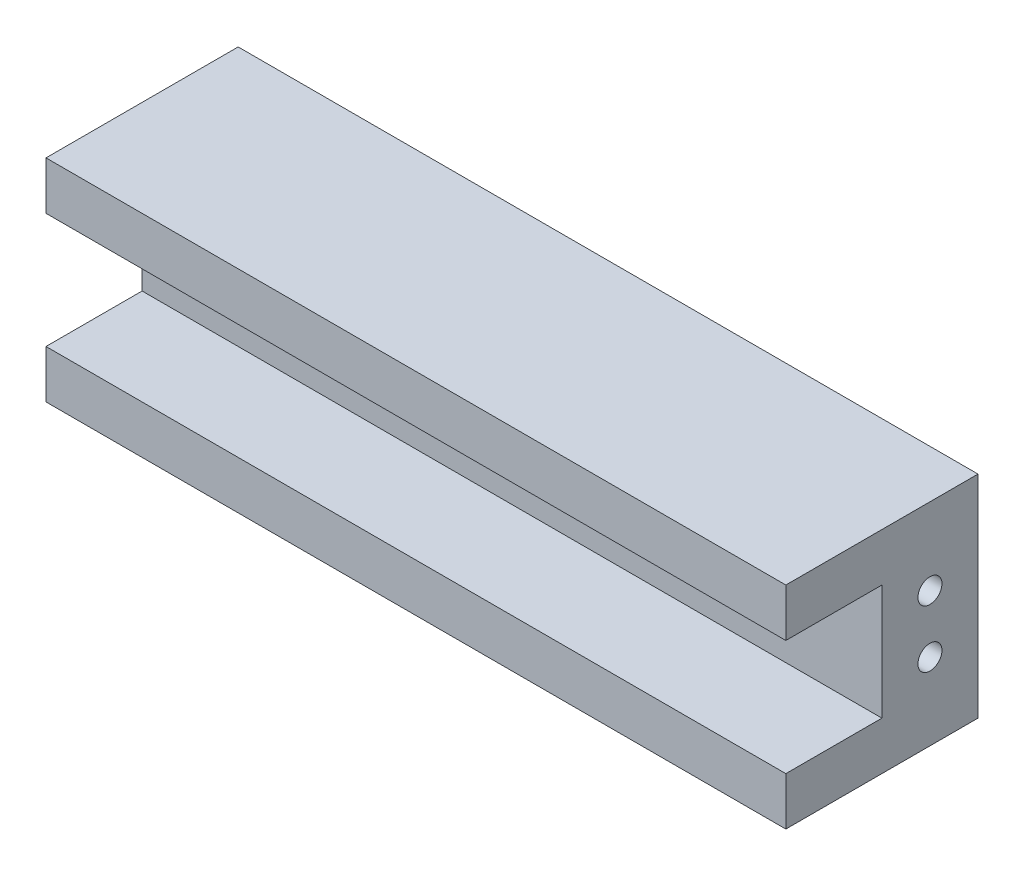
ISO-10303-21;
HEADER;
FILE_DESCRIPTION(('STEP AP214'),'2;1');
FILE_NAME('part.step','',(''),(''),'','','');
FILE_SCHEMA(('AUTOMOTIVE_DESIGN { 1 0 10303 214 1 1 1 1 }'));
ENDSEC;
DATA;
#1=APPLICATION_CONTEXT('core data for automotive mechanical design processes');
#2=APPLICATION_PROTOCOL_DEFINITION('international standard','automotive_design',2000,#1);
#3=PRODUCT_CONTEXT('',#1,'mechanical');
#4=PRODUCT('Part','Part','',(#3));
#5=PRODUCT_RELATED_PRODUCT_CATEGORY('part','',(#4));
#6=PRODUCT_DEFINITION_FORMATION('','',#4);
#7=PRODUCT_DEFINITION_CONTEXT('part definition',#1,'design');
#8=PRODUCT_DEFINITION('design','',#6,#7);
#9=PRODUCT_DEFINITION_SHAPE('','',#8);
#10=(LENGTH_UNIT() NAMED_UNIT(*) SI_UNIT(.MILLI.,.METRE.));
#11=(NAMED_UNIT(*) PLANE_ANGLE_UNIT() SI_UNIT($,.RADIAN.));
#12=(NAMED_UNIT(*) SI_UNIT($,.STERADIAN.) SOLID_ANGLE_UNIT());
#13=UNCERTAINTY_MEASURE_WITH_UNIT(LENGTH_MEASURE(1.E-05),#10,'distance_accuracy_value','');
#14=(GEOMETRIC_REPRESENTATION_CONTEXT(3) GLOBAL_UNCERTAINTY_ASSIGNED_CONTEXT((#13)) GLOBAL_UNIT_ASSIGNED_CONTEXT((#10,
#11,#12)) REPRESENTATION_CONTEXT('',''));
#15=CARTESIAN_POINT('',(0.,0.,0.));
#16=DIRECTION('',(0.,0.,1.));
#17=DIRECTION('',(1.,0.,0.));
#18=AXIS2_PLACEMENT_3D('',#15,#16,#17);
#19=CARTESIAN_POINT('',(0.,0.,10.));
#20=DIRECTION('',(1.,0.,0.));
#21=DIRECTION('',(0.,0.,-1.));
#22=AXIS2_PLACEMENT_3D('',#19,#20,#21);
#23=PLANE('',#22);
#24=CARTESIAN_POINT('',(0.,3.,5.));
#25=DIRECTION('',(1.,0.,0.));
#26=DIRECTION('',(0.,0.,-1.));
#27=AXIS2_PLACEMENT_3D('',#24,#25,#26);
#28=CIRCLE('',#27,1.25);
#29=CARTESIAN_POINT('',(0.,3.,3.75));
#30=VERTEX_POINT('',#29);
#31=EDGE_CURVE('E158',#30,#30,#28,.T.);
#32=ORIENTED_EDGE('',*,*,#31,.T.);
#33=EDGE_LOOP('',(#32));
#34=FACE_BOUND('',#33,.T.);
#35=CARTESIAN_POINT('',(0.,9.,5.));
#36=DIRECTION('',(1.,0.,0.));
#37=DIRECTION('',(0.,0.,-1.));
#38=AXIS2_PLACEMENT_3D('',#35,#36,#37);
#39=CIRCLE('',#38,1.25);
#40=CARTESIAN_POINT('',(0.,9.,3.75));
#41=VERTEX_POINT('',#40);
#42=EDGE_CURVE('E153',#41,#41,#39,.T.);
#43=ORIENTED_EDGE('',*,*,#42,.T.);
#44=EDGE_LOOP('',(#43));
#45=FACE_BOUND('',#44,.T.);
#46=DIRECTION('',(0.,-1.,0.));
#47=VECTOR('',#46,1.);
#48=CARTESIAN_POINT('',(0.,0.,0.));
#49=LINE('',#48,#47);
#50=CARTESIAN_POINT('',(0.,17.,0.));
#51=VERTEX_POINT('',#50);
#52=CARTESIAN_POINT('',(0.,-5.,0.));
#53=VERTEX_POINT('',#52);
#54=EDGE_CURVE('E169',#51,#53,#49,.T.);
#55=ORIENTED_EDGE('',*,*,#54,.T.);
#56=DIRECTION('',(0.,0.,1.));
#57=VECTOR('',#56,1.);
#58=CARTESIAN_POINT('',(0.,-5.,0.));
#59=LINE('',#58,#57);
#60=CARTESIAN_POINT('',(0.,-5.,20.));
#61=VERTEX_POINT('',#60);
#62=EDGE_CURVE('E122',#53,#61,#59,.T.);
#63=ORIENTED_EDGE('',*,*,#62,.T.);
#64=DIRECTION('',(0.,1.,0.));
#65=VECTOR('',#64,1.);
#66=CARTESIAN_POINT('',(0.,-5.,20.));
#67=LINE('',#66,#65);
#68=CARTESIAN_POINT('',(0.,0.,20.));
#69=VERTEX_POINT('',#68);
#70=EDGE_CURVE('E108',#61,#69,#67,.T.);
#71=ORIENTED_EDGE('',*,*,#70,.T.);
#72=DIRECTION('',(0.,0.,1.));
#73=VECTOR('',#72,1.);
#74=CARTESIAN_POINT('',(0.,0.,0.));
#75=LINE('',#74,#73);
#76=CARTESIAN_POINT('',(0.,0.,10.));
#77=VERTEX_POINT('',#76);
#78=EDGE_CURVE('E118',#77,#69,#75,.T.);
#79=ORIENTED_EDGE('',*,*,#78,.F.);
#80=DIRECTION('',(0.,-1.,0.));
#81=VECTOR('',#80,1.);
#82=CARTESIAN_POINT('',(0.,0.,10.));
#83=LINE('',#82,#81);
#84=CARTESIAN_POINT('',(0.,12.,10.));
#85=VERTEX_POINT('',#84);
#86=EDGE_CURVE('E178',#85,#77,#83,.T.);
#87=ORIENTED_EDGE('',*,*,#86,.F.);
#88=DIRECTION('',(0.,0.,1.));
#89=VECTOR('',#88,1.);
#90=CARTESIAN_POINT('',(0.,12.,0.));
#91=LINE('',#90,#89);
#92=CARTESIAN_POINT('',(0.,12.,20.));
#93=VERTEX_POINT('',#92);
#94=EDGE_CURVE('E49',#85,#93,#91,.T.);
#95=ORIENTED_EDGE('',*,*,#94,.T.);
#96=DIRECTION('',(0.,-1.,0.));
#97=VECTOR('',#96,1.);
#98=CARTESIAN_POINT('',(0.,17.,20.));
#99=LINE('',#98,#97);
#100=CARTESIAN_POINT('',(0.,17.,20.));
#101=VERTEX_POINT('',#100);
#102=EDGE_CURVE('E150',#101,#93,#99,.T.);
#103=ORIENTED_EDGE('',*,*,#102,.F.);
#104=DIRECTION('',(0.,0.,1.));
#105=VECTOR('',#104,1.);
#106=CARTESIAN_POINT('',(0.,17.,0.));
#107=LINE('',#106,#105);
#108=EDGE_CURVE('E139',#51,#101,#107,.T.);
#109=ORIENTED_EDGE('',*,*,#108,.F.);
#110=EDGE_LOOP('',(#55,#63,#71,#79,#87,#95,#103,#109));
#111=FACE_BOUND('',#110,.T.);
#112=ADVANCED_FACE('F33',(#34,#45,#111),#23,.F.);
#113=CARTESIAN_POINT('',(77.,0.,10.));
#114=DIRECTION('',(-1.,0.,0.));
#115=DIRECTION('',(0.,0.,1.));
#116=AXIS2_PLACEMENT_3D('',#113,#114,#115);
#117=PLANE('',#116);
#118=CARTESIAN_POINT('',(77.,3.,5.));
#119=DIRECTION('',(1.,0.,0.));
#120=DIRECTION('',(0.,0.,-1.));
#121=AXIS2_PLACEMENT_3D('',#118,#119,#120);
#122=CIRCLE('',#121,1.25);
#123=CARTESIAN_POINT('',(77.,3.,3.75));
#124=VERTEX_POINT('',#123);
#125=EDGE_CURVE('E170',#124,#124,#122,.T.);
#126=ORIENTED_EDGE('',*,*,#125,.F.);
#127=EDGE_LOOP('',(#126));
#128=FACE_BOUND('',#127,.T.);
#129=CARTESIAN_POINT('',(77.,9.,5.));
#130=DIRECTION('',(1.,0.,0.));
#131=DIRECTION('',(0.,0.,-1.));
#132=AXIS2_PLACEMENT_3D('',#129,#130,#131);
#133=CIRCLE('',#132,1.25);
#134=CARTESIAN_POINT('',(77.,9.,3.75));
#135=VERTEX_POINT('',#134);
#136=EDGE_CURVE('E173',#135,#135,#133,.T.);
#137=ORIENTED_EDGE('',*,*,#136,.F.);
#138=EDGE_LOOP('',(#137));
#139=FACE_BOUND('',#138,.T.);
#140=DIRECTION('',(0.,1.,0.));
#141=VECTOR('',#140,1.);
#142=CARTESIAN_POINT('',(77.,0.,0.));
#143=LINE('',#142,#141);
#144=CARTESIAN_POINT('',(77.,-5.,0.));
#145=VERTEX_POINT('',#144);
#146=CARTESIAN_POINT('',(77.,17.,0.));
#147=VERTEX_POINT('',#146);
#148=EDGE_CURVE('E36',#145,#147,#143,.T.);
#149=ORIENTED_EDGE('',*,*,#148,.T.);
#150=DIRECTION('',(0.,0.,-1.));
#151=VECTOR('',#150,1.);
#152=CARTESIAN_POINT('',(77.,17.,0.));
#153=LINE('',#152,#151);
#154=CARTESIAN_POINT('',(77.,17.,20.));
#155=VERTEX_POINT('',#154);
#156=EDGE_CURVE('E132',#155,#147,#153,.T.);
#157=ORIENTED_EDGE('',*,*,#156,.F.);
#158=DIRECTION('',(0.,-1.,0.));
#159=VECTOR('',#158,1.);
#160=CARTESIAN_POINT('',(77.,17.,20.));
#161=LINE('',#160,#159);
#162=CARTESIAN_POINT('',(77.,12.,20.));
#163=VERTEX_POINT('',#162);
#164=EDGE_CURVE('E143',#155,#163,#161,.T.);
#165=ORIENTED_EDGE('',*,*,#164,.T.);
#166=DIRECTION('',(0.,0.,-1.));
#167=VECTOR('',#166,1.);
#168=CARTESIAN_POINT('',(77.,12.,0.));
#169=LINE('',#168,#167);
#170=CARTESIAN_POINT('',(77.,12.,10.));
#171=VERTEX_POINT('',#170);
#172=EDGE_CURVE('E107',#163,#171,#169,.T.);
#173=ORIENTED_EDGE('',*,*,#172,.T.);
#174=DIRECTION('',(0.,1.,0.));
#175=VECTOR('',#174,1.);
#176=CARTESIAN_POINT('',(77.,0.,10.));
#177=LINE('',#176,#175);
#178=CARTESIAN_POINT('',(77.,0.,10.));
#179=VERTEX_POINT('',#178);
#180=EDGE_CURVE('E41',#179,#171,#177,.T.);
#181=ORIENTED_EDGE('',*,*,#180,.F.);
#182=DIRECTION('',(0.,0.,-1.));
#183=VECTOR('',#182,1.);
#184=CARTESIAN_POINT('',(77.,0.,0.));
#185=LINE('',#184,#183);
#186=CARTESIAN_POINT('',(77.,0.,20.));
#187=VERTEX_POINT('',#186);
#188=EDGE_CURVE('E56',#187,#179,#185,.T.);
#189=ORIENTED_EDGE('',*,*,#188,.F.);
#190=DIRECTION('',(0.,1.,0.));
#191=VECTOR('',#190,1.);
#192=CARTESIAN_POINT('',(77.,-5.,20.));
#193=LINE('',#192,#191);
#194=CARTESIAN_POINT('',(77.,-5.,20.));
#195=VERTEX_POINT('',#194);
#196=EDGE_CURVE('E98',#195,#187,#193,.T.);
#197=ORIENTED_EDGE('',*,*,#196,.F.);
#198=DIRECTION('',(0.,0.,-1.));
#199=VECTOR('',#198,1.);
#200=CARTESIAN_POINT('',(77.,-5.,0.));
#201=LINE('',#200,#199);
#202=EDGE_CURVE('E101',#195,#145,#201,.T.);
#203=ORIENTED_EDGE('',*,*,#202,.T.);
#204=EDGE_LOOP('',(#149,#157,#165,#173,#181,#189,#197,#203));
#205=FACE_BOUND('',#204,.T.);
#206=ADVANCED_FACE('F100',(#128,#139,#205),#117,.F.);
#207=CARTESIAN_POINT('',(0.,0.,10.));
#208=DIRECTION('',(0.,0.,-1.));
#209=DIRECTION('',(-1.,0.,0.));
#210=AXIS2_PLACEMENT_3D('',#207,#208,#209);
#211=PLANE('',#210);
#212=ORIENTED_EDGE('',*,*,#86,.T.);
#213=DIRECTION('',(1.,0.,0.));
#214=VECTOR('',#213,1.);
#215=CARTESIAN_POINT('',(0.,0.,10.));
#216=LINE('',#215,#214);
#217=EDGE_CURVE('E181',#77,#179,#216,.T.);
#218=ORIENTED_EDGE('',*,*,#217,.T.);
#219=ORIENTED_EDGE('',*,*,#180,.T.);
#220=DIRECTION('',(-1.,0.,0.));
#221=VECTOR('',#220,1.);
#222=CARTESIAN_POINT('',(0.,12.,10.));
#223=LINE('',#222,#221);
#224=EDGE_CURVE('E11',#171,#85,#223,.T.);
#225=ORIENTED_EDGE('',*,*,#224,.T.);
#226=EDGE_LOOP('',(#212,#218,#219,#225));
#227=FACE_BOUND('',#226,.T.);
#228=ADVANCED_FACE('F201',(#227),#211,.F.);
#229=CARTESIAN_POINT('',(0.,0.,0.));
#230=DIRECTION('',(0.,0.,-1.));
#231=DIRECTION('',(-1.,0.,0.));
#232=AXIS2_PLACEMENT_3D('',#229,#230,#231);
#233=PLANE('',#232);
#234=ORIENTED_EDGE('',*,*,#54,.F.);
#235=DIRECTION('',(-1.,0.,0.));
#236=VECTOR('',#235,1.);
#237=CARTESIAN_POINT('',(77.,17.,0.));
#238=LINE('',#237,#236);
#239=EDGE_CURVE('E135',#147,#51,#238,.T.);
#240=ORIENTED_EDGE('',*,*,#239,.F.);
#241=ORIENTED_EDGE('',*,*,#148,.F.);
#242=DIRECTION('',(-1.,0.,0.));
#243=VECTOR('',#242,1.);
#244=CARTESIAN_POINT('',(77.,-5.,0.));
#245=LINE('',#244,#243);
#246=EDGE_CURVE('E117',#145,#53,#245,.T.);
#247=ORIENTED_EDGE('',*,*,#246,.T.);
#248=EDGE_LOOP('',(#234,#240,#241,#247));
#249=FACE_BOUND('',#248,.T.);
#250=ADVANCED_FACE('F189',(#249),#233,.T.);
#251=CARTESIAN_POINT('',(65.,9.,5.));
#252=DIRECTION('',(1.,0.,0.));
#253=DIRECTION('',(0.,0.,-1.));
#254=AXIS2_PLACEMENT_3D('',#251,#252,#253);
#255=CYLINDRICAL_SURFACE('',#254,1.25);
#256=CARTESIAN_POINT('',(65.,9.,5.));
#257=DIRECTION('',(1.,0.,0.));
#258=DIRECTION('',(0.,0.,-1.));
#259=AXIS2_PLACEMENT_3D('',#256,#257,#258);
#260=CIRCLE('',#259,1.25);
#261=CARTESIAN_POINT('',(65.,9.,3.75));
#262=VERTEX_POINT('',#261);
#263=EDGE_CURVE('E157',#262,#262,#260,.T.);
#264=ORIENTED_EDGE('',*,*,#263,.F.);
#265=EDGE_LOOP('',(#264));
#266=FACE_BOUND('',#265,.T.);
#267=ORIENTED_EDGE('',*,*,#136,.T.);
#268=EDGE_LOOP('',(#267));
#269=FACE_BOUND('',#268,.T.);
#270=ADVANCED_FACE('F246',(#266,#269),#255,.F.);
#271=CARTESIAN_POINT('',(65.,9.,5.));
#272=DIRECTION('',(1.,0.,0.));
#273=DIRECTION('',(0.,0.,-1.));
#274=AXIS2_PLACEMENT_3D('',#271,#272,#273);
#275=PLANE('',#274);
#276=ORIENTED_EDGE('',*,*,#263,.T.);
#277=EDGE_LOOP('',(#276));
#278=FACE_BOUND('',#277,.T.);
#279=ADVANCED_FACE('F244',(#278),#275,.T.);
#280=CARTESIAN_POINT('',(65.,3.,5.));
#281=DIRECTION('',(1.,0.,0.));
#282=DIRECTION('',(0.,0.,-1.));
#283=AXIS2_PLACEMENT_3D('',#280,#281,#282);
#284=CYLINDRICAL_SURFACE('',#283,1.25);
#285=CARTESIAN_POINT('',(65.,3.,5.));
#286=DIRECTION('',(1.,0.,0.));
#287=DIRECTION('',(0.,0.,-1.));
#288=AXIS2_PLACEMENT_3D('',#285,#286,#287);
#289=CIRCLE('',#288,1.25);
#290=CARTESIAN_POINT('',(65.,3.,3.75));
#291=VERTEX_POINT('',#290);
#292=EDGE_CURVE('E166',#291,#291,#289,.T.);
#293=ORIENTED_EDGE('',*,*,#292,.F.);
#294=EDGE_LOOP('',(#293));
#295=FACE_BOUND('',#294,.T.);
#296=ORIENTED_EDGE('',*,*,#125,.T.);
#297=EDGE_LOOP('',(#296));
#298=FACE_BOUND('',#297,.T.);
#299=ADVANCED_FACE('F237',(#295,#298),#284,.F.);
#300=CARTESIAN_POINT('',(65.,3.,5.));
#301=DIRECTION('',(1.,0.,0.));
#302=DIRECTION('',(0.,0.,-1.));
#303=AXIS2_PLACEMENT_3D('',#300,#301,#302);
#304=PLANE('',#303);
#305=ORIENTED_EDGE('',*,*,#292,.T.);
#306=EDGE_LOOP('',(#305));
#307=FACE_BOUND('',#306,.T.);
#308=ADVANCED_FACE('F227',(#307),#304,.T.);
#309=CARTESIAN_POINT('',(12.,9.,5.));
#310=DIRECTION('',(-1.,0.,0.));
#311=DIRECTION('',(0.,0.,1.));
#312=AXIS2_PLACEMENT_3D('',#309,#310,#311);
#313=CYLINDRICAL_SURFACE('',#312,1.25);
#314=CARTESIAN_POINT('',(12.,9.,5.));
#315=DIRECTION('',(1.,0.,0.));
#316=DIRECTION('',(0.,0.,-1.));
#317=AXIS2_PLACEMENT_3D('',#314,#315,#316);
#318=CIRCLE('',#317,1.25);
#319=CARTESIAN_POINT('',(12.,9.,3.75));
#320=VERTEX_POINT('',#319);
#321=EDGE_CURVE('E161',#320,#320,#318,.T.);
#322=ORIENTED_EDGE('',*,*,#321,.T.);
#323=EDGE_LOOP('',(#322));
#324=FACE_BOUND('',#323,.T.);
#325=ORIENTED_EDGE('',*,*,#42,.F.);
#326=EDGE_LOOP('',(#325));
#327=FACE_BOUND('',#326,.T.);
#328=ADVANCED_FACE('F224',(#324,#327),#313,.F.);
#329=CARTESIAN_POINT('',(12.,9.,5.));
#330=DIRECTION('',(-1.,0.,0.));
#331=DIRECTION('',(0.,0.,-1.));
#332=AXIS2_PLACEMENT_3D('',#329,#330,#331);
#333=PLANE('',#332);
#334=ORIENTED_EDGE('',*,*,#321,.F.);
#335=EDGE_LOOP('',(#334));
#336=FACE_BOUND('',#335,.T.);
#337=ADVANCED_FACE('F226',(#336),#333,.T.);
#338=CARTESIAN_POINT('',(12.,3.,5.));
#339=DIRECTION('',(-1.,0.,0.));
#340=DIRECTION('',(0.,0.,1.));
#341=AXIS2_PLACEMENT_3D('',#338,#339,#340);
#342=CYLINDRICAL_SURFACE('',#341,1.25);
#343=CARTESIAN_POINT('',(12.,3.,5.));
#344=DIRECTION('',(1.,0.,0.));
#345=DIRECTION('',(0.,0.,-1.));
#346=AXIS2_PLACEMENT_3D('',#343,#344,#345);
#347=CIRCLE('',#346,1.25);
#348=CARTESIAN_POINT('',(12.,3.,3.75));
#349=VERTEX_POINT('',#348);
#350=EDGE_CURVE('E154',#349,#349,#347,.T.);
#351=ORIENTED_EDGE('',*,*,#350,.T.);
#352=EDGE_LOOP('',(#351));
#353=FACE_BOUND('',#352,.T.);
#354=ORIENTED_EDGE('',*,*,#31,.F.);
#355=EDGE_LOOP('',(#354));
#356=FACE_BOUND('',#355,.T.);
#357=ADVANCED_FACE('F234',(#353,#356),#342,.F.);
#358=CARTESIAN_POINT('',(12.,3.,5.));
#359=DIRECTION('',(-1.,0.,0.));
#360=DIRECTION('',(0.,0.,-1.));
#361=AXIS2_PLACEMENT_3D('',#358,#359,#360);
#362=PLANE('',#361);
#363=ORIENTED_EDGE('',*,*,#350,.F.);
#364=EDGE_LOOP('',(#363));
#365=FACE_BOUND('',#364,.T.);
#366=ADVANCED_FACE('F266',(#365),#362,.T.);
#367=CARTESIAN_POINT('',(0.,12.,0.));
#368=DIRECTION('',(0.,-1.,0.));
#369=DIRECTION('',(1.,0.,0.));
#370=AXIS2_PLACEMENT_3D('',#367,#368,#369);
#371=PLANE('',#370);
#372=ORIENTED_EDGE('',*,*,#224,.F.);
#373=ORIENTED_EDGE('',*,*,#172,.F.);
#374=DIRECTION('',(1.,0.,0.));
#375=VECTOR('',#374,1.);
#376=CARTESIAN_POINT('',(77.,12.,20.));
#377=LINE('',#376,#375);
#378=EDGE_CURVE('E136',#93,#163,#377,.T.);
#379=ORIENTED_EDGE('',*,*,#378,.F.);
#380=ORIENTED_EDGE('',*,*,#94,.F.);
#381=EDGE_LOOP('',(#372,#373,#379,#380));
#382=FACE_BOUND('',#381,.T.);
#383=ADVANCED_FACE('F198',(#382),#371,.T.);
#384=CARTESIAN_POINT('',(77.,17.,20.));
#385=DIRECTION('',(0.,0.,-1.));
#386=DIRECTION('',(-1.,0.,0.));
#387=AXIS2_PLACEMENT_3D('',#384,#385,#386);
#388=PLANE('',#387);
#389=ORIENTED_EDGE('',*,*,#378,.T.);
#390=ORIENTED_EDGE('',*,*,#164,.F.);
#391=DIRECTION('',(1.,0.,0.));
#392=VECTOR('',#391,1.);
#393=CARTESIAN_POINT('',(77.,17.,20.));
#394=LINE('',#393,#392);
#395=EDGE_CURVE('E141',#101,#155,#394,.T.);
#396=ORIENTED_EDGE('',*,*,#395,.F.);
#397=ORIENTED_EDGE('',*,*,#102,.T.);
#398=EDGE_LOOP('',(#389,#390,#396,#397));
#399=FACE_BOUND('',#398,.T.);
#400=ADVANCED_FACE('F196',(#399),#388,.F.);
#401=CARTESIAN_POINT('',(0.,17.,0.));
#402=DIRECTION('',(0.,-1.,0.));
#403=DIRECTION('',(1.,0.,0.));
#404=AXIS2_PLACEMENT_3D('',#401,#402,#403);
#405=PLANE('',#404);
#406=ORIENTED_EDGE('',*,*,#156,.T.);
#407=ORIENTED_EDGE('',*,*,#239,.T.);
#408=ORIENTED_EDGE('',*,*,#108,.T.);
#409=ORIENTED_EDGE('',*,*,#395,.T.);
#410=EDGE_LOOP('',(#406,#407,#408,#409));
#411=FACE_BOUND('',#410,.T.);
#412=ADVANCED_FACE('F191',(#411),#405,.F.);
#413=CARTESIAN_POINT('',(0.,0.,0.));
#414=DIRECTION('',(0.,1.,0.));
#415=DIRECTION('',(1.,0.,0.));
#416=AXIS2_PLACEMENT_3D('',#413,#414,#415);
#417=PLANE('',#416);
#418=ORIENTED_EDGE('',*,*,#217,.F.);
#419=ORIENTED_EDGE('',*,*,#78,.T.);
#420=DIRECTION('',(1.,0.,0.));
#421=VECTOR('',#420,1.);
#422=CARTESIAN_POINT('',(77.,0.,20.));
#423=LINE('',#422,#421);
#424=EDGE_CURVE('E128',#69,#187,#423,.T.);
#425=ORIENTED_EDGE('',*,*,#424,.T.);
#426=ORIENTED_EDGE('',*,*,#188,.T.);
#427=EDGE_LOOP('',(#418,#419,#425,#426));
#428=FACE_BOUND('',#427,.T.);
#429=ADVANCED_FACE('F203',(#428),#417,.T.);
#430=CARTESIAN_POINT('',(77.,-5.,20.));
#431=DIRECTION('',(0.,0.,1.));
#432=DIRECTION('',(1.,0.,0.));
#433=AXIS2_PLACEMENT_3D('',#430,#431,#432);
#434=PLANE('',#433);
#435=ORIENTED_EDGE('',*,*,#424,.F.);
#436=ORIENTED_EDGE('',*,*,#70,.F.);
#437=DIRECTION('',(1.,0.,0.));
#438=VECTOR('',#437,1.);
#439=CARTESIAN_POINT('',(77.,-5.,20.));
#440=LINE('',#439,#438);
#441=EDGE_CURVE('E114',#61,#195,#440,.T.);
#442=ORIENTED_EDGE('',*,*,#441,.T.);
#443=ORIENTED_EDGE('',*,*,#196,.T.);
#444=EDGE_LOOP('',(#435,#436,#442,#443));
#445=FACE_BOUND('',#444,.T.);
#446=ADVANCED_FACE('F120',(#445),#434,.T.);
#447=CARTESIAN_POINT('',(0.,-5.,0.));
#448=DIRECTION('',(0.,1.,0.));
#449=DIRECTION('',(1.,0.,0.));
#450=AXIS2_PLACEMENT_3D('',#447,#448,#449);
#451=PLANE('',#450);
#452=ORIENTED_EDGE('',*,*,#202,.F.);
#453=ORIENTED_EDGE('',*,*,#441,.F.);
#454=ORIENTED_EDGE('',*,*,#62,.F.);
#455=ORIENTED_EDGE('',*,*,#246,.F.);
#456=EDGE_LOOP('',(#452,#453,#454,#455));
#457=FACE_BOUND('',#456,.T.);
#458=ADVANCED_FACE('F112',(#457),#451,.F.);
#459=CLOSED_SHELL('',(#112,#206,#228,#250,#270,#279,#299,#308,#328,#337,#357,#366,#383,#400,
#412,#429,#446,#458));
#460=MANIFOLD_SOLID_BREP('B2',#459);
#461=ADVANCED_BREP_SHAPE_REPRESENTATION('',(#18,#460),#14);
#462=SHAPE_DEFINITION_REPRESENTATION(#9,#461);
ENDSEC;
END-ISO-10303-21;
